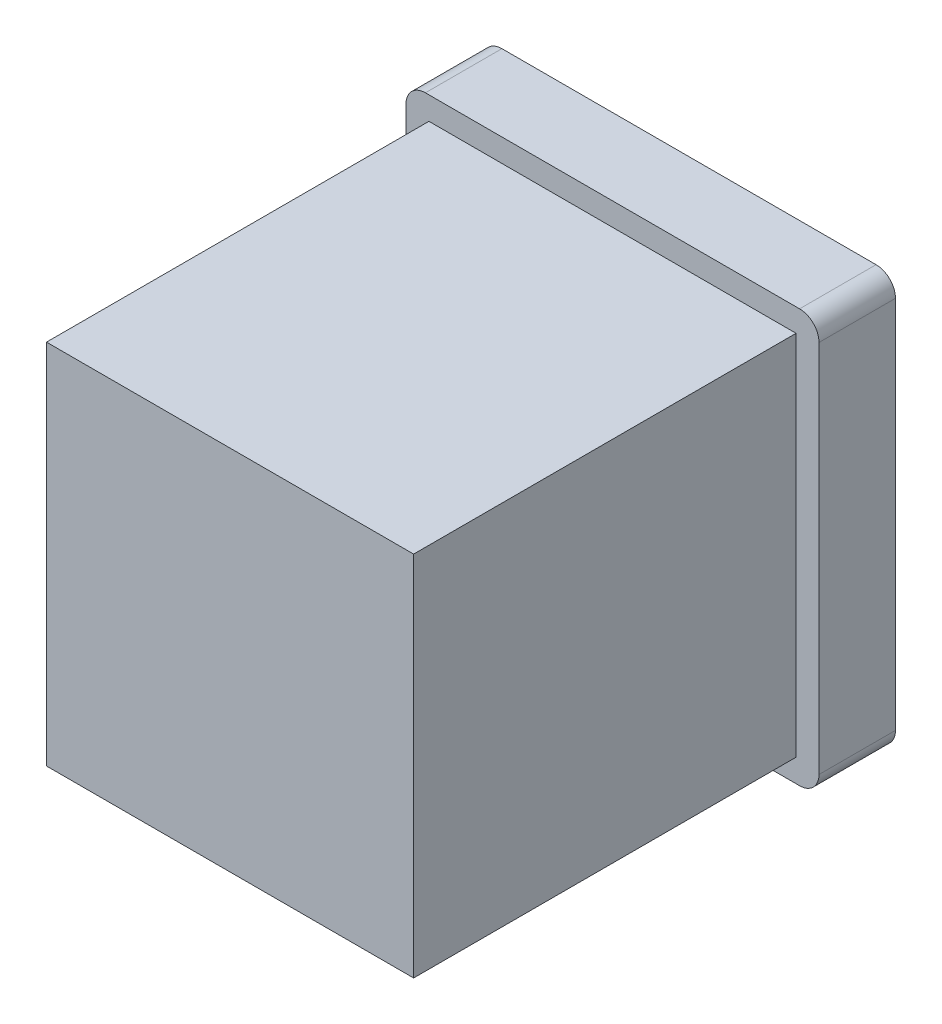
ISO-10303-21;
HEADER;
FILE_DESCRIPTION(('STEP AP214'),'2;1');
FILE_NAME('part.step','',(''),(''),'','','');
FILE_SCHEMA(('AUTOMOTIVE_DESIGN { 1 0 10303 214 1 1 1 1 }'));
ENDSEC;
DATA;
#1=APPLICATION_CONTEXT('core data for automotive mechanical design processes');
#2=APPLICATION_PROTOCOL_DEFINITION('international standard','automotive_design',2000,#1);
#3=PRODUCT_CONTEXT('',#1,'mechanical');
#4=PRODUCT('Part','Part','',(#3));
#5=PRODUCT_RELATED_PRODUCT_CATEGORY('part','',(#4));
#6=PRODUCT_DEFINITION_FORMATION('','',#4);
#7=PRODUCT_DEFINITION_CONTEXT('part definition',#1,'design');
#8=PRODUCT_DEFINITION('design','',#6,#7);
#9=PRODUCT_DEFINITION_SHAPE('','',#8);
#10=(LENGTH_UNIT() NAMED_UNIT(*) SI_UNIT(.MILLI.,.METRE.));
#11=(NAMED_UNIT(*) PLANE_ANGLE_UNIT() SI_UNIT($,.RADIAN.));
#12=(NAMED_UNIT(*) SI_UNIT($,.STERADIAN.) SOLID_ANGLE_UNIT());
#13=UNCERTAINTY_MEASURE_WITH_UNIT(LENGTH_MEASURE(1.E-05),#10,'distance_accuracy_value','');
#14=(GEOMETRIC_REPRESENTATION_CONTEXT(3) GLOBAL_UNCERTAINTY_ASSIGNED_CONTEXT((#13)) GLOBAL_UNIT_ASSIGNED_CONTEXT((#10,
#11,#12)) REPRESENTATION_CONTEXT('',''));
#15=CARTESIAN_POINT('',(0.,0.,0.));
#16=DIRECTION('',(0.,0.,1.));
#17=DIRECTION('',(1.,0.,0.));
#18=AXIS2_PLACEMENT_3D('',#15,#16,#17);
#19=CARTESIAN_POINT('',(0.,0.,5.));
#20=DIRECTION('',(0.,0.,-1.));
#21=DIRECTION('',(-1.,0.,0.));
#22=AXIS2_PLACEMENT_3D('',#19,#20,#21);
#23=PLANE('',#22);
#24=DIRECTION('',(0.,-1.,0.));
#25=VECTOR('',#24,1.);
#26=CARTESIAN_POINT('',(0.,0.,5.));
#27=LINE('',#26,#25);
#28=CARTESIAN_POINT('',(0.,25.73,5.));
#29=VERTEX_POINT('',#28);
#30=CARTESIAN_POINT('',(0.,1.27,5.));
#31=VERTEX_POINT('',#30);
#32=EDGE_CURVE('E330',#29,#31,#27,.T.);
#33=ORIENTED_EDGE('',*,*,#32,.T.);
#34=CARTESIAN_POINT('',(1.27,1.27,5.));
#35=DIRECTION('',(0.,0.,-1.));
#36=DIRECTION('',(-1.,0.,0.));
#37=AXIS2_PLACEMENT_3D('',#34,#35,#36);
#38=CIRCLE('',#37,1.27);
#39=CARTESIAN_POINT('',(1.27,0.,5.));
#40=VERTEX_POINT('',#39);
#41=EDGE_CURVE('E377',#31,#40,#38,.F.);
#42=ORIENTED_EDGE('',*,*,#41,.T.);
#43=DIRECTION('',(1.,0.,0.));
#44=VECTOR('',#43,1.);
#45=CARTESIAN_POINT('',(0.,0.,5.));
#46=LINE('',#45,#44);
#47=CARTESIAN_POINT('',(25.73,0.,5.));
#48=VERTEX_POINT('',#47);
#49=EDGE_CURVE('E333',#40,#48,#46,.T.);
#50=ORIENTED_EDGE('',*,*,#49,.T.);
#51=CARTESIAN_POINT('',(25.73,1.27,5.));
#52=DIRECTION('',(0.,0.,-1.));
#53=DIRECTION('',(-1.,0.,0.));
#54=AXIS2_PLACEMENT_3D('',#51,#52,#53);
#55=CIRCLE('',#54,1.27);
#56=CARTESIAN_POINT('',(27.,1.27,5.));
#57=VERTEX_POINT('',#56);
#58=EDGE_CURVE('E375',#48,#57,#55,.F.);
#59=ORIENTED_EDGE('',*,*,#58,.T.);
#60=DIRECTION('',(0.,1.,0.));
#61=VECTOR('',#60,1.);
#62=CARTESIAN_POINT('',(27.,0.,5.));
#63=LINE('',#62,#61);
#64=CARTESIAN_POINT('',(27.,25.73,5.));
#65=VERTEX_POINT('',#64);
#66=EDGE_CURVE('E337',#57,#65,#63,.T.);
#67=ORIENTED_EDGE('',*,*,#66,.T.);
#68=CARTESIAN_POINT('',(25.73,25.73,5.));
#69=DIRECTION('',(0.,0.,-1.));
#70=DIRECTION('',(-1.,0.,0.));
#71=AXIS2_PLACEMENT_3D('',#68,#69,#70);
#72=CIRCLE('',#71,1.27);
#73=CARTESIAN_POINT('',(25.73,27.,5.));
#74=VERTEX_POINT('',#73);
#75=EDGE_CURVE('E371',#65,#74,#72,.F.);
#76=ORIENTED_EDGE('',*,*,#75,.T.);
#77=DIRECTION('',(-1.,0.,0.));
#78=VECTOR('',#77,1.);
#79=CARTESIAN_POINT('',(0.,27.,5.));
#80=LINE('',#79,#78);
#81=CARTESIAN_POINT('',(1.27,27.,5.));
#82=VERTEX_POINT('',#81);
#83=EDGE_CURVE('E340',#74,#82,#80,.T.);
#84=ORIENTED_EDGE('',*,*,#83,.T.);
#85=CARTESIAN_POINT('',(1.27,25.73,5.));
#86=DIRECTION('',(0.,0.,-1.));
#87=DIRECTION('',(-1.,0.,0.));
#88=AXIS2_PLACEMENT_3D('',#85,#86,#87);
#89=CIRCLE('',#88,1.27);
#90=EDGE_CURVE('E373',#82,#29,#89,.F.);
#91=ORIENTED_EDGE('',*,*,#90,.T.);
#92=EDGE_LOOP('',(#33,#42,#50,#59,#67,#76,#84,#91));
#93=FACE_BOUND('',#92,.T.);
#94=DIRECTION('',(0.,-1.,0.));
#95=VECTOR('',#94,1.);
#96=CARTESIAN_POINT('',(1.5,25.5,5.));
#97=LINE('',#96,#95);
#98=CARTESIAN_POINT('',(1.5,25.5,5.));
#99=VERTEX_POINT('',#98);
#100=CARTESIAN_POINT('',(1.5,1.5,5.));
#101=VERTEX_POINT('',#100);
#102=EDGE_CURVE('E290',#99,#101,#97,.T.);
#103=ORIENTED_EDGE('',*,*,#102,.F.);
#104=DIRECTION('',(-1.,0.,0.));
#105=VECTOR('',#104,1.);
#106=CARTESIAN_POINT('',(1.5,25.5,5.));
#107=LINE('',#106,#105);
#108=CARTESIAN_POINT('',(25.5,25.5,5.));
#109=VERTEX_POINT('',#108);
#110=EDGE_CURVE('E301',#109,#99,#107,.T.);
#111=ORIENTED_EDGE('',*,*,#110,.F.);
#112=DIRECTION('',(0.,1.,0.));
#113=VECTOR('',#112,1.);
#114=CARTESIAN_POINT('',(25.5,25.5,5.));
#115=LINE('',#114,#113);
#116=CARTESIAN_POINT('',(25.5,1.5,5.));
#117=VERTEX_POINT('',#116);
#118=EDGE_CURVE('E313',#117,#109,#115,.T.);
#119=ORIENTED_EDGE('',*,*,#118,.F.);
#120=DIRECTION('',(1.,0.,0.));
#121=VECTOR('',#120,1.);
#122=CARTESIAN_POINT('',(1.5,1.5,5.));
#123=LINE('',#122,#121);
#124=EDGE_CURVE('E310',#101,#117,#123,.T.);
#125=ORIENTED_EDGE('',*,*,#124,.F.);
#126=EDGE_LOOP('',(#103,#111,#119,#125));
#127=FACE_BOUND('',#126,.T.);
#128=ADVANCED_FACE('F36',(#93,#127),#23,.F.);
#129=CARTESIAN_POINT('',(0.,0.,5.));
#130=DIRECTION('',(1.,0.,0.));
#131=DIRECTION('',(0.,1.,0.));
#132=AXIS2_PLACEMENT_3D('',#129,#130,#131);
#133=PLANE('',#132);
#134=DIRECTION('',(0.,-1.,0.));
#135=VECTOR('',#134,1.);
#136=CARTESIAN_POINT('',(0.,0.,0.));
#137=LINE('',#136,#135);
#138=CARTESIAN_POINT('',(0.,25.73,0.));
#139=VERTEX_POINT('',#138);
#140=CARTESIAN_POINT('',(0.,1.27,0.));
#141=VERTEX_POINT('',#140);
#142=EDGE_CURVE('E329',#139,#141,#137,.T.);
#143=ORIENTED_EDGE('',*,*,#142,.T.);
#144=DIRECTION('',(0.,0.,-1.));
#145=VECTOR('',#144,1.);
#146=CARTESIAN_POINT('',(0.,1.27,5.));
#147=LINE('',#146,#145);
#148=EDGE_CURVE('E369',#141,#31,#147,.F.);
#149=ORIENTED_EDGE('',*,*,#148,.T.);
#150=ORIENTED_EDGE('',*,*,#32,.F.);
#151=DIRECTION('',(0.,0.,-1.));
#152=VECTOR('',#151,1.);
#153=CARTESIAN_POINT('',(0.,25.73,5.));
#154=LINE('',#153,#152);
#155=EDGE_CURVE('E366',#29,#139,#154,.T.);
#156=ORIENTED_EDGE('',*,*,#155,.T.);
#157=EDGE_LOOP('',(#143,#149,#150,#156));
#158=FACE_BOUND('',#157,.T.);
#159=ADVANCED_FACE('F403',(#158),#133,.F.);
#160=CARTESIAN_POINT('',(0.,0.,5.));
#161=DIRECTION('',(0.,1.,0.));
#162=DIRECTION('',(0.,0.,1.));
#163=AXIS2_PLACEMENT_3D('',#160,#161,#162);
#164=PLANE('',#163);
#165=ORIENTED_EDGE('',*,*,#49,.F.);
#166=DIRECTION('',(0.,0.,-1.));
#167=VECTOR('',#166,1.);
#168=CARTESIAN_POINT('',(1.27,0.,5.));
#169=LINE('',#168,#167);
#170=CARTESIAN_POINT('',(1.27,0.,0.));
#171=VERTEX_POINT('',#170);
#172=EDGE_CURVE('E355',#40,#171,#169,.T.);
#173=ORIENTED_EDGE('',*,*,#172,.T.);
#174=DIRECTION('',(1.,0.,0.));
#175=VECTOR('',#174,1.);
#176=CARTESIAN_POINT('',(0.,0.,0.));
#177=LINE('',#176,#175);
#178=CARTESIAN_POINT('',(25.73,0.,0.));
#179=VERTEX_POINT('',#178);
#180=EDGE_CURVE('E346',#171,#179,#177,.T.);
#181=ORIENTED_EDGE('',*,*,#180,.T.);
#182=DIRECTION('',(0.,0.,-1.));
#183=VECTOR('',#182,1.);
#184=CARTESIAN_POINT('',(25.73,0.,5.));
#185=LINE('',#184,#183);
#186=EDGE_CURVE('E343',#179,#48,#185,.F.);
#187=ORIENTED_EDGE('',*,*,#186,.T.);
#188=EDGE_LOOP('',(#165,#173,#181,#187));
#189=FACE_BOUND('',#188,.T.);
#190=ADVANCED_FACE('F413',(#189),#164,.F.);
#191=CARTESIAN_POINT('',(27.,0.,5.));
#192=DIRECTION('',(-1.,0.,0.));
#193=DIRECTION('',(0.,-1.,0.));
#194=AXIS2_PLACEMENT_3D('',#191,#192,#193);
#195=PLANE('',#194);
#196=ORIENTED_EDGE('',*,*,#66,.F.);
#197=DIRECTION('',(0.,0.,-1.));
#198=VECTOR('',#197,1.);
#199=CARTESIAN_POINT('',(27.,1.27,5.));
#200=LINE('',#199,#198);
#201=CARTESIAN_POINT('',(27.,1.27,0.));
#202=VERTEX_POINT('',#201);
#203=EDGE_CURVE('E381',#57,#202,#200,.T.);
#204=ORIENTED_EDGE('',*,*,#203,.T.);
#205=DIRECTION('',(0.,1.,0.));
#206=VECTOR('',#205,1.);
#207=CARTESIAN_POINT('',(27.,0.,0.));
#208=LINE('',#207,#206);
#209=CARTESIAN_POINT('',(27.,25.73,0.));
#210=VERTEX_POINT('',#209);
#211=EDGE_CURVE('E349',#202,#210,#208,.T.);
#212=ORIENTED_EDGE('',*,*,#211,.T.);
#213=DIRECTION('',(0.,0.,-1.));
#214=VECTOR('',#213,1.);
#215=CARTESIAN_POINT('',(27.,25.73,5.));
#216=LINE('',#215,#214);
#217=EDGE_CURVE('E379',#210,#65,#216,.F.);
#218=ORIENTED_EDGE('',*,*,#217,.T.);
#219=EDGE_LOOP('',(#196,#204,#212,#218));
#220=FACE_BOUND('',#219,.T.);
#221=ADVANCED_FACE('F421',(#220),#195,.F.);
#222=CARTESIAN_POINT('',(0.,27.,5.));
#223=DIRECTION('',(0.,-1.,0.));
#224=DIRECTION('',(0.,0.,-1.));
#225=AXIS2_PLACEMENT_3D('',#222,#223,#224);
#226=PLANE('',#225);
#227=DIRECTION('',(-1.,0.,0.));
#228=VECTOR('',#227,1.);
#229=CARTESIAN_POINT('',(0.,27.,0.));
#230=LINE('',#229,#228);
#231=CARTESIAN_POINT('',(25.73,27.,0.));
#232=VERTEX_POINT('',#231);
#233=CARTESIAN_POINT('',(1.27,27.,0.));
#234=VERTEX_POINT('',#233);
#235=EDGE_CURVE('E334',#232,#234,#230,.T.);
#236=ORIENTED_EDGE('',*,*,#235,.T.);
#237=DIRECTION('',(0.,0.,-1.));
#238=VECTOR('',#237,1.);
#239=CARTESIAN_POINT('',(1.27,27.,5.));
#240=LINE('',#239,#238);
#241=EDGE_CURVE('E11',#234,#82,#240,.F.);
#242=ORIENTED_EDGE('',*,*,#241,.T.);
#243=ORIENTED_EDGE('',*,*,#83,.F.);
#244=DIRECTION('',(0.,0.,-1.));
#245=VECTOR('',#244,1.);
#246=CARTESIAN_POINT('',(25.73,27.,5.));
#247=LINE('',#246,#245);
#248=EDGE_CURVE('E44',#74,#232,#247,.T.);
#249=ORIENTED_EDGE('',*,*,#248,.T.);
#250=EDGE_LOOP('',(#236,#242,#243,#249));
#251=FACE_BOUND('',#250,.T.);
#252=ADVANCED_FACE('F388',(#251),#226,.F.);
#253=CARTESIAN_POINT('',(0.,0.,0.));
#254=DIRECTION('',(0.,0.,-1.));
#255=DIRECTION('',(-1.,0.,0.));
#256=AXIS2_PLACEMENT_3D('',#253,#254,#255);
#257=PLANE('',#256);
#258=CARTESIAN_POINT('',(13.6249536569698,7.82953983743972,0.));
#259=DIRECTION('',(0.,0.,-1.));
#260=DIRECTION('',(-1.,0.,0.));
#261=AXIS2_PLACEMENT_3D('',#258,#259,#260);
#262=CIRCLE('',#261,2.66495365696981);
#263=CARTESIAN_POINT('',(11.0849536569698,8.636,0.));
#264=VERTEX_POINT('',#263);
#265=CARTESIAN_POINT('',(16.1649536569698,8.636,0.));
#266=VERTEX_POINT('',#265);
#267=EDGE_CURVE('E51',#264,#266,#262,.T.);
#268=ORIENTED_EDGE('',*,*,#267,.F.);
#269=DIRECTION('',(0.,1.,0.));
#270=VECTOR('',#269,1.);
#271=CARTESIAN_POINT('',(11.0849536569698,5.08,0.));
#272=LINE('',#271,#270);
#273=CARTESIAN_POINT('',(11.0849536569698,5.08,0.));
#274=VERTEX_POINT('',#273);
#275=EDGE_CURVE('E216',#274,#264,#272,.T.);
#276=ORIENTED_EDGE('',*,*,#275,.F.);
#277=DIRECTION('',(-1.,0.,0.));
#278=VECTOR('',#277,1.);
#279=CARTESIAN_POINT('',(16.1649536569698,5.08,0.));
#280=LINE('',#279,#278);
#281=CARTESIAN_POINT('',(16.1649536569698,5.08,0.));
#282=VERTEX_POINT('',#281);
#283=EDGE_CURVE('E219',#282,#274,#280,.T.);
#284=ORIENTED_EDGE('',*,*,#283,.F.);
#285=DIRECTION('',(0.,-1.,0.));
#286=VECTOR('',#285,1.);
#287=CARTESIAN_POINT('',(16.1649536569698,5.08,0.));
#288=LINE('',#287,#286);
#289=EDGE_CURVE('E225',#266,#282,#288,.T.);
#290=ORIENTED_EDGE('',*,*,#289,.F.);
#291=EDGE_LOOP('',(#268,#276,#284,#290));
#292=FACE_BOUND('',#291,.T.);
#293=DIRECTION('',(0.,-1.,0.));
#294=VECTOR('',#293,1.);
#295=CARTESIAN_POINT('',(8.89,23.19,0.));
#296=LINE('',#295,#294);
#297=CARTESIAN_POINT('',(8.89,23.19,0.));
#298=VERTEX_POINT('',#297);
#299=CARTESIAN_POINT('',(8.89,15.57,0.));
#300=VERTEX_POINT('',#299);
#301=EDGE_CURVE('E59',#298,#300,#296,.T.);
#302=ORIENTED_EDGE('',*,*,#301,.F.);
#303=DIRECTION('',(1.,0.,0.));
#304=VECTOR('',#303,1.);
#305=CARTESIAN_POINT('',(8.89,23.19,0.));
#306=LINE('',#305,#304);
#307=CARTESIAN_POINT('',(6.35,23.19,0.));
#308=VERTEX_POINT('',#307);
#309=EDGE_CURVE('E238',#308,#298,#306,.T.);
#310=ORIENTED_EDGE('',*,*,#309,.F.);
#311=DIRECTION('',(0.,1.,0.));
#312=VECTOR('',#311,1.);
#313=CARTESIAN_POINT('',(6.35,23.19,0.));
#314=LINE('',#313,#312);
#315=CARTESIAN_POINT('',(6.35,15.57,0.));
#316=VERTEX_POINT('',#315);
#317=EDGE_CURVE('E252',#316,#308,#314,.T.);
#318=ORIENTED_EDGE('',*,*,#317,.F.);
#319=DIRECTION('',(-1.,0.,0.));
#320=VECTOR('',#319,1.);
#321=CARTESIAN_POINT('',(8.89,15.57,0.));
#322=LINE('',#321,#320);
#323=EDGE_CURVE('E249',#300,#316,#322,.T.);
#324=ORIENTED_EDGE('',*,*,#323,.F.);
#325=EDGE_LOOP('',(#302,#310,#318,#324));
#326=FACE_BOUND('',#325,.T.);
#327=DIRECTION('',(0.,-1.,0.));
#328=VECTOR('',#327,1.);
#329=CARTESIAN_POINT('',(20.65,23.19,0.));
#330=LINE('',#329,#328);
#331=CARTESIAN_POINT('',(20.65,23.19,0.));
#332=VERTEX_POINT('',#331);
#333=CARTESIAN_POINT('',(20.65,15.57,0.));
#334=VERTEX_POINT('',#333);
#335=EDGE_CURVE('E259',#332,#334,#330,.T.);
#336=ORIENTED_EDGE('',*,*,#335,.F.);
#337=DIRECTION('',(1.,0.,0.));
#338=VECTOR('',#337,1.);
#339=CARTESIAN_POINT('',(20.65,23.19,0.));
#340=LINE('',#339,#338);
#341=CARTESIAN_POINT('',(18.11,23.19,0.));
#342=VERTEX_POINT('',#341);
#343=EDGE_CURVE('E269',#342,#332,#340,.T.);
#344=ORIENTED_EDGE('',*,*,#343,.F.);
#345=DIRECTION('',(0.,1.,0.));
#346=VECTOR('',#345,1.);
#347=CARTESIAN_POINT('',(18.11,23.19,0.));
#348=LINE('',#347,#346);
#349=CARTESIAN_POINT('',(18.11,15.57,0.));
#350=VERTEX_POINT('',#349);
#351=EDGE_CURVE('E283',#350,#342,#348,.T.);
#352=ORIENTED_EDGE('',*,*,#351,.F.);
#353=DIRECTION('',(-1.,0.,0.));
#354=VECTOR('',#353,1.);
#355=CARTESIAN_POINT('',(20.65,15.57,0.));
#356=LINE('',#355,#354);
#357=EDGE_CURVE('E280',#334,#350,#356,.T.);
#358=ORIENTED_EDGE('',*,*,#357,.F.);
#359=EDGE_LOOP('',(#336,#344,#352,#358));
#360=FACE_BOUND('',#359,.T.);
#361=ORIENTED_EDGE('',*,*,#180,.F.);
#362=CARTESIAN_POINT('',(1.27,1.27,0.));
#363=DIRECTION('',(0.,0.,-1.));
#364=DIRECTION('',(-1.,0.,0.));
#365=AXIS2_PLACEMENT_3D('',#362,#363,#364);
#366=CIRCLE('',#365,1.27);
#367=EDGE_CURVE('E364',#171,#141,#366,.T.);
#368=ORIENTED_EDGE('',*,*,#367,.T.);
#369=ORIENTED_EDGE('',*,*,#142,.F.);
#370=CARTESIAN_POINT('',(1.27,25.73,0.));
#371=DIRECTION('',(0.,0.,-1.));
#372=DIRECTION('',(-1.,0.,0.));
#373=AXIS2_PLACEMENT_3D('',#370,#371,#372);
#374=CIRCLE('',#373,1.27);
#375=EDGE_CURVE('E360',#139,#234,#374,.T.);
#376=ORIENTED_EDGE('',*,*,#375,.T.);
#377=ORIENTED_EDGE('',*,*,#235,.F.);
#378=CARTESIAN_POINT('',(25.73,25.73,0.));
#379=DIRECTION('',(0.,0.,-1.));
#380=DIRECTION('',(-1.,0.,0.));
#381=AXIS2_PLACEMENT_3D('',#378,#379,#380);
#382=CIRCLE('',#381,1.27);
#383=EDGE_CURVE('E358',#232,#210,#382,.T.);
#384=ORIENTED_EDGE('',*,*,#383,.T.);
#385=ORIENTED_EDGE('',*,*,#211,.F.);
#386=CARTESIAN_POINT('',(25.73,1.27,0.));
#387=DIRECTION('',(0.,0.,-1.));
#388=DIRECTION('',(-1.,0.,0.));
#389=AXIS2_PLACEMENT_3D('',#386,#387,#388);
#390=CIRCLE('',#389,1.27);
#391=EDGE_CURVE('E362',#202,#179,#390,.T.);
#392=ORIENTED_EDGE('',*,*,#391,.T.);
#393=EDGE_LOOP('',(#361,#368,#369,#376,#377,#384,#385,#392));
#394=FACE_BOUND('',#393,.T.);
#395=ADVANCED_FACE('F394',(#292,#326,#360,#394),#257,.T.);
#396=CARTESIAN_POINT('',(1.5,25.5,30.));
#397=DIRECTION('',(1.,0.,0.));
#398=DIRECTION('',(0.,1.,0.));
#399=AXIS2_PLACEMENT_3D('',#396,#397,#398);
#400=PLANE('',#399);
#401=ORIENTED_EDGE('',*,*,#102,.T.);
#402=DIRECTION('',(0.,0.,-1.));
#403=VECTOR('',#402,1.);
#404=CARTESIAN_POINT('',(1.5,1.5,30.));
#405=LINE('',#404,#403);
#406=CARTESIAN_POINT('',(1.5,1.5,30.));
#407=VERTEX_POINT('',#406);
#408=EDGE_CURVE('E326',#407,#101,#405,.T.);
#409=ORIENTED_EDGE('',*,*,#408,.F.);
#410=DIRECTION('',(0.,-1.,0.));
#411=VECTOR('',#410,1.);
#412=CARTESIAN_POINT('',(1.5,25.5,30.));
#413=LINE('',#412,#411);
#414=CARTESIAN_POINT('',(1.5,25.5,30.));
#415=VERTEX_POINT('',#414);
#416=EDGE_CURVE('E297',#415,#407,#413,.T.);
#417=ORIENTED_EDGE('',*,*,#416,.F.);
#418=DIRECTION('',(0.,0.,-1.));
#419=VECTOR('',#418,1.);
#420=CARTESIAN_POINT('',(1.5,25.5,30.));
#421=LINE('',#420,#419);
#422=EDGE_CURVE('E307',#415,#99,#421,.T.);
#423=ORIENTED_EDGE('',*,*,#422,.T.);
#424=EDGE_LOOP('',(#401,#409,#417,#423));
#425=FACE_BOUND('',#424,.T.);
#426=ADVANCED_FACE('F440',(#425),#400,.F.);
#427=CARTESIAN_POINT('',(1.5,1.5,30.));
#428=DIRECTION('',(0.,1.,0.));
#429=DIRECTION('',(-1.,0.,0.));
#430=AXIS2_PLACEMENT_3D('',#427,#428,#429);
#431=PLANE('',#430);
#432=ORIENTED_EDGE('',*,*,#124,.T.);
#433=DIRECTION('',(0.,0.,-1.));
#434=VECTOR('',#433,1.);
#435=CARTESIAN_POINT('',(25.5,1.5,30.));
#436=LINE('',#435,#434);
#437=CARTESIAN_POINT('',(25.5,1.5,30.));
#438=VERTEX_POINT('',#437);
#439=EDGE_CURVE('E323',#438,#117,#436,.T.);
#440=ORIENTED_EDGE('',*,*,#439,.F.);
#441=DIRECTION('',(1.,0.,0.));
#442=VECTOR('',#441,1.);
#443=CARTESIAN_POINT('',(1.5,1.5,30.));
#444=LINE('',#443,#442);
#445=EDGE_CURVE('E300',#407,#438,#444,.T.);
#446=ORIENTED_EDGE('',*,*,#445,.F.);
#447=ORIENTED_EDGE('',*,*,#408,.T.);
#448=EDGE_LOOP('',(#432,#440,#446,#447));
#449=FACE_BOUND('',#448,.T.);
#450=ADVANCED_FACE('F629',(#449),#431,.F.);
#451=CARTESIAN_POINT('',(25.5,25.5,30.));
#452=DIRECTION('',(-1.,0.,0.));
#453=DIRECTION('',(0.,0.,1.));
#454=AXIS2_PLACEMENT_3D('',#451,#452,#453);
#455=PLANE('',#454);
#456=ORIENTED_EDGE('',*,*,#118,.T.);
#457=DIRECTION('',(0.,0.,-1.));
#458=VECTOR('',#457,1.);
#459=CARTESIAN_POINT('',(25.5,25.5,30.));
#460=LINE('',#459,#458);
#461=CARTESIAN_POINT('',(25.5,25.5,30.));
#462=VERTEX_POINT('',#461);
#463=EDGE_CURVE('E320',#462,#109,#460,.T.);
#464=ORIENTED_EDGE('',*,*,#463,.F.);
#465=DIRECTION('',(0.,1.,0.));
#466=VECTOR('',#465,1.);
#467=CARTESIAN_POINT('',(25.5,25.5,30.));
#468=LINE('',#467,#466);
#469=EDGE_CURVE('E303',#438,#462,#468,.T.);
#470=ORIENTED_EDGE('',*,*,#469,.F.);
#471=ORIENTED_EDGE('',*,*,#439,.T.);
#472=EDGE_LOOP('',(#456,#464,#470,#471));
#473=FACE_BOUND('',#472,.T.);
#474=ADVANCED_FACE('F626',(#473),#455,.F.);
#475=CARTESIAN_POINT('',(1.5,25.5,30.));
#476=DIRECTION('',(0.,-1.,0.));
#477=DIRECTION('',(0.,0.,-1.));
#478=AXIS2_PLACEMENT_3D('',#475,#476,#477);
#479=PLANE('',#478);
#480=ORIENTED_EDGE('',*,*,#110,.T.);
#481=ORIENTED_EDGE('',*,*,#422,.F.);
#482=DIRECTION('',(-1.,0.,0.));
#483=VECTOR('',#482,1.);
#484=CARTESIAN_POINT('',(1.5,25.5,30.));
#485=LINE('',#484,#483);
#486=EDGE_CURVE('E305',#462,#415,#485,.T.);
#487=ORIENTED_EDGE('',*,*,#486,.F.);
#488=ORIENTED_EDGE('',*,*,#463,.T.);
#489=EDGE_LOOP('',(#480,#481,#487,#488));
#490=FACE_BOUND('',#489,.T.);
#491=ADVANCED_FACE('F622',(#490),#479,.F.);
#492=CARTESIAN_POINT('',(0.,0.,30.));
#493=DIRECTION('',(0.,0.,1.));
#494=DIRECTION('',(1.,0.,0.));
#495=AXIS2_PLACEMENT_3D('',#492,#493,#494);
#496=PLANE('',#495);
#497=ORIENTED_EDGE('',*,*,#416,.T.);
#498=ORIENTED_EDGE('',*,*,#445,.T.);
#499=ORIENTED_EDGE('',*,*,#469,.T.);
#500=ORIENTED_EDGE('',*,*,#486,.T.);
#501=EDGE_LOOP('',(#497,#498,#499,#500));
#502=FACE_BOUND('',#501,.T.);
#503=ADVANCED_FACE('F453',(#502),#496,.T.);
#504=CARTESIAN_POINT('',(1.27,1.27,5.));
#505=DIRECTION('',(0.,0.,-1.));
#506=DIRECTION('',(-1.,0.,0.));
#507=AXIS2_PLACEMENT_3D('',#504,#505,#506);
#508=CYLINDRICAL_SURFACE('',#507,1.27);
#509=ORIENTED_EDGE('',*,*,#41,.F.);
#510=ORIENTED_EDGE('',*,*,#148,.F.);
#511=ORIENTED_EDGE('',*,*,#367,.F.);
#512=ORIENTED_EDGE('',*,*,#172,.F.);
#513=EDGE_LOOP('',(#509,#510,#511,#512));
#514=FACE_BOUND('',#513,.T.);
#515=ADVANCED_FACE('F411',(#514),#508,.T.);
#516=CARTESIAN_POINT('',(25.73,1.27,5.));
#517=DIRECTION('',(0.,0.,-1.));
#518=DIRECTION('',(-1.,0.,0.));
#519=AXIS2_PLACEMENT_3D('',#516,#517,#518);
#520=CYLINDRICAL_SURFACE('',#519,1.27);
#521=ORIENTED_EDGE('',*,*,#58,.F.);
#522=ORIENTED_EDGE('',*,*,#186,.F.);
#523=ORIENTED_EDGE('',*,*,#391,.F.);
#524=ORIENTED_EDGE('',*,*,#203,.F.);
#525=EDGE_LOOP('',(#521,#522,#523,#524));
#526=FACE_BOUND('',#525,.T.);
#527=ADVANCED_FACE('F418',(#526),#520,.T.);
#528=CARTESIAN_POINT('',(1.27,25.73,5.));
#529=DIRECTION('',(0.,0.,-1.));
#530=DIRECTION('',(-1.,0.,0.));
#531=AXIS2_PLACEMENT_3D('',#528,#529,#530);
#532=CYLINDRICAL_SURFACE('',#531,1.27);
#533=ORIENTED_EDGE('',*,*,#90,.F.);
#534=ORIENTED_EDGE('',*,*,#241,.F.);
#535=ORIENTED_EDGE('',*,*,#375,.F.);
#536=ORIENTED_EDGE('',*,*,#155,.F.);
#537=EDGE_LOOP('',(#533,#534,#535,#536));
#538=FACE_BOUND('',#537,.T.);
#539=ADVANCED_FACE('F400',(#538),#532,.T.);
#540=CARTESIAN_POINT('',(25.73,25.73,5.));
#541=DIRECTION('',(0.,0.,-1.));
#542=DIRECTION('',(-1.,0.,0.));
#543=AXIS2_PLACEMENT_3D('',#540,#541,#542);
#544=CYLINDRICAL_SURFACE('',#543,1.27);
#545=ORIENTED_EDGE('',*,*,#75,.F.);
#546=ORIENTED_EDGE('',*,*,#217,.F.);
#547=ORIENTED_EDGE('',*,*,#383,.F.);
#548=ORIENTED_EDGE('',*,*,#248,.F.);
#549=EDGE_LOOP('',(#545,#546,#547,#548));
#550=FACE_BOUND('',#549,.T.);
#551=ADVANCED_FACE('F38',(#550),#544,.T.);
#552=CARTESIAN_POINT('',(20.65,23.19,2.54));
#553=DIRECTION('',(1.,0.,0.));
#554=DIRECTION('',(0.,0.,-1.));
#555=AXIS2_PLACEMENT_3D('',#552,#553,#554);
#556=PLANE('',#555);
#557=ORIENTED_EDGE('',*,*,#335,.T.);
#558=DIRECTION('',(0.,0.,-1.));
#559=VECTOR('',#558,1.);
#560=CARTESIAN_POINT('',(20.65,15.57,2.54));
#561=LINE('',#560,#559);
#562=CARTESIAN_POINT('',(20.65,15.57,2.54));
#563=VERTEX_POINT('',#562);
#564=EDGE_CURVE('E278',#563,#334,#561,.T.);
#565=ORIENTED_EDGE('',*,*,#564,.F.);
#566=DIRECTION('',(0.,-1.,0.));
#567=VECTOR('',#566,1.);
#568=CARTESIAN_POINT('',(20.65,23.19,2.54));
#569=LINE('',#568,#567);
#570=CARTESIAN_POINT('',(20.65,23.19,2.54));
#571=VERTEX_POINT('',#570);
#572=EDGE_CURVE('E265',#571,#563,#569,.T.);
#573=ORIENTED_EDGE('',*,*,#572,.F.);
#574=DIRECTION('',(0.,0.,-1.));
#575=VECTOR('',#574,1.);
#576=CARTESIAN_POINT('',(20.65,23.19,2.54));
#577=LINE('',#576,#575);
#578=EDGE_CURVE('E288',#571,#332,#577,.T.);
#579=ORIENTED_EDGE('',*,*,#578,.T.);
#580=EDGE_LOOP('',(#557,#565,#573,#579));
#581=FACE_BOUND('',#580,.T.);
#582=ADVANCED_FACE('F424',(#581),#556,.F.);
#583=CARTESIAN_POINT('',(20.65,23.19,2.54));
#584=DIRECTION('',(0.,1.,0.));
#585=DIRECTION('',(0.,0.,1.));
#586=AXIS2_PLACEMENT_3D('',#583,#584,#585);
#587=PLANE('',#586);
#588=ORIENTED_EDGE('',*,*,#343,.T.);
#589=ORIENTED_EDGE('',*,*,#578,.F.);
#590=DIRECTION('',(1.,0.,0.));
#591=VECTOR('',#590,1.);
#592=CARTESIAN_POINT('',(20.65,23.19,2.54));
#593=LINE('',#592,#591);
#594=CARTESIAN_POINT('',(18.11,23.19,2.54));
#595=VERTEX_POINT('',#594);
#596=EDGE_CURVE('E275',#595,#571,#593,.T.);
#597=ORIENTED_EDGE('',*,*,#596,.F.);
#598=DIRECTION('',(0.,0.,-1.));
#599=VECTOR('',#598,1.);
#600=CARTESIAN_POINT('',(18.11,23.19,2.54));
#601=LINE('',#600,#599);
#602=EDGE_CURVE('E291',#595,#342,#601,.T.);
#603=ORIENTED_EDGE('',*,*,#602,.T.);
#604=EDGE_LOOP('',(#588,#589,#597,#603));
#605=FACE_BOUND('',#604,.T.);
#606=ADVANCED_FACE('F429',(#605),#587,.F.);
#607=CARTESIAN_POINT('',(18.11,23.19,2.54));
#608=DIRECTION('',(-1.,0.,0.));
#609=DIRECTION('',(0.,-1.,0.));
#610=AXIS2_PLACEMENT_3D('',#607,#608,#609);
#611=PLANE('',#610);
#612=ORIENTED_EDGE('',*,*,#351,.T.);
#613=ORIENTED_EDGE('',*,*,#602,.F.);
#614=DIRECTION('',(0.,1.,0.));
#615=VECTOR('',#614,1.);
#616=CARTESIAN_POINT('',(18.11,23.19,2.54));
#617=LINE('',#616,#615);
#618=CARTESIAN_POINT('',(18.11,15.57,2.54));
#619=VERTEX_POINT('',#618);
#620=EDGE_CURVE('E272',#619,#595,#617,.T.);
#621=ORIENTED_EDGE('',*,*,#620,.F.);
#622=DIRECTION('',(0.,0.,-1.));
#623=VECTOR('',#622,1.);
#624=CARTESIAN_POINT('',(18.11,15.57,2.54));
#625=LINE('',#624,#623);
#626=EDGE_CURVE('E293',#619,#350,#625,.T.);
#627=ORIENTED_EDGE('',*,*,#626,.T.);
#628=EDGE_LOOP('',(#612,#613,#621,#627));
#629=FACE_BOUND('',#628,.T.);
#630=ADVANCED_FACE('F491',(#629),#611,.F.);
#631=CARTESIAN_POINT('',(20.65,15.57,2.54));
#632=DIRECTION('',(0.,-1.,0.));
#633=DIRECTION('',(1.,0.,0.));
#634=AXIS2_PLACEMENT_3D('',#631,#632,#633);
#635=PLANE('',#634);
#636=ORIENTED_EDGE('',*,*,#357,.T.);
#637=ORIENTED_EDGE('',*,*,#626,.F.);
#638=DIRECTION('',(-1.,0.,0.));
#639=VECTOR('',#638,1.);
#640=CARTESIAN_POINT('',(20.65,15.57,2.54));
#641=LINE('',#640,#639);
#642=EDGE_CURVE('E268',#563,#619,#641,.T.);
#643=ORIENTED_EDGE('',*,*,#642,.F.);
#644=ORIENTED_EDGE('',*,*,#564,.T.);
#645=EDGE_LOOP('',(#636,#637,#643,#644));
#646=FACE_BOUND('',#645,.T.);
#647=ADVANCED_FACE('F501',(#646),#635,.F.);
#648=CARTESIAN_POINT('',(0.,0.,2.54));
#649=DIRECTION('',(0.,0.,-1.));
#650=DIRECTION('',(-1.,0.,0.));
#651=AXIS2_PLACEMENT_3D('',#648,#649,#650);
#652=PLANE('',#651);
#653=ORIENTED_EDGE('',*,*,#572,.T.);
#654=ORIENTED_EDGE('',*,*,#642,.T.);
#655=ORIENTED_EDGE('',*,*,#620,.T.);
#656=ORIENTED_EDGE('',*,*,#596,.T.);
#657=EDGE_LOOP('',(#653,#654,#655,#656));
#658=FACE_BOUND('',#657,.T.);
#659=ADVANCED_FACE('F511',(#658),#652,.T.);
#660=CARTESIAN_POINT('',(8.89,23.19,2.54));
#661=DIRECTION('',(1.,0.,0.));
#662=DIRECTION('',(0.,1.,0.));
#663=AXIS2_PLACEMENT_3D('',#660,#661,#662);
#664=PLANE('',#663);
#665=ORIENTED_EDGE('',*,*,#301,.T.);
#666=DIRECTION('',(0.,0.,-1.));
#667=VECTOR('',#666,1.);
#668=CARTESIAN_POINT('',(8.89,15.57,2.54));
#669=LINE('',#668,#667);
#670=CARTESIAN_POINT('',(8.89,15.57,2.54));
#671=VERTEX_POINT('',#670);
#672=EDGE_CURVE('E247',#671,#300,#669,.T.);
#673=ORIENTED_EDGE('',*,*,#672,.F.);
#674=DIRECTION('',(0.,-1.,0.));
#675=VECTOR('',#674,1.);
#676=CARTESIAN_POINT('',(8.89,23.19,2.54));
#677=LINE('',#676,#675);
#678=CARTESIAN_POINT('',(8.89,23.19,2.54));
#679=VERTEX_POINT('',#678);
#680=EDGE_CURVE('E234',#679,#671,#677,.T.);
#681=ORIENTED_EDGE('',*,*,#680,.F.);
#682=DIRECTION('',(0.,0.,-1.));
#683=VECTOR('',#682,1.);
#684=CARTESIAN_POINT('',(8.89,23.19,2.54));
#685=LINE('',#684,#683);
#686=EDGE_CURVE('E257',#679,#298,#685,.T.);
#687=ORIENTED_EDGE('',*,*,#686,.T.);
#688=EDGE_LOOP('',(#665,#673,#681,#687));
#689=FACE_BOUND('',#688,.T.);
#690=ADVANCED_FACE('F521',(#689),#664,.F.);
#691=CARTESIAN_POINT('',(8.89,23.19,2.54));
#692=DIRECTION('',(0.,1.,0.));
#693=DIRECTION('',(-1.,0.,0.));
#694=AXIS2_PLACEMENT_3D('',#691,#692,#693);
#695=PLANE('',#694);
#696=ORIENTED_EDGE('',*,*,#309,.T.);
#697=ORIENTED_EDGE('',*,*,#686,.F.);
#698=DIRECTION('',(1.,0.,0.));
#699=VECTOR('',#698,1.);
#700=CARTESIAN_POINT('',(8.89,23.19,2.54));
#701=LINE('',#700,#699);
#702=CARTESIAN_POINT('',(6.35,23.19,2.54));
#703=VERTEX_POINT('',#702);
#704=EDGE_CURVE('E244',#703,#679,#701,.T.);
#705=ORIENTED_EDGE('',*,*,#704,.F.);
#706=DIRECTION('',(0.,0.,-1.));
#707=VECTOR('',#706,1.);
#708=CARTESIAN_POINT('',(6.35,23.19,2.54));
#709=LINE('',#708,#707);
#710=EDGE_CURVE('E260',#703,#308,#709,.T.);
#711=ORIENTED_EDGE('',*,*,#710,.T.);
#712=EDGE_LOOP('',(#696,#697,#705,#711));
#713=FACE_BOUND('',#712,.T.);
#714=ADVANCED_FACE('F531',(#713),#695,.F.);
#715=CARTESIAN_POINT('',(6.35,23.19,2.54));
#716=DIRECTION('',(-1.,0.,0.));
#717=DIRECTION('',(0.,-1.,0.));
#718=AXIS2_PLACEMENT_3D('',#715,#716,#717);
#719=PLANE('',#718);
#720=ORIENTED_EDGE('',*,*,#317,.T.);
#721=ORIENTED_EDGE('',*,*,#710,.F.);
#722=DIRECTION('',(0.,1.,0.));
#723=VECTOR('',#722,1.);
#724=CARTESIAN_POINT('',(6.35,23.19,2.54));
#725=LINE('',#724,#723);
#726=CARTESIAN_POINT('',(6.35,15.57,2.54));
#727=VERTEX_POINT('',#726);
#728=EDGE_CURVE('E241',#727,#703,#725,.T.);
#729=ORIENTED_EDGE('',*,*,#728,.F.);
#730=DIRECTION('',(0.,0.,-1.));
#731=VECTOR('',#730,1.);
#732=CARTESIAN_POINT('',(6.35,15.57,2.54));
#733=LINE('',#732,#731);
#734=EDGE_CURVE('E262',#727,#316,#733,.T.);
#735=ORIENTED_EDGE('',*,*,#734,.T.);
#736=EDGE_LOOP('',(#720,#721,#729,#735));
#737=FACE_BOUND('',#736,.T.);
#738=ADVANCED_FACE('F540',(#737),#719,.F.);
#739=CARTESIAN_POINT('',(8.89,15.57,2.54));
#740=DIRECTION('',(0.,-1.,0.));
#741=DIRECTION('',(0.,0.,-1.));
#742=AXIS2_PLACEMENT_3D('',#739,#740,#741);
#743=PLANE('',#742);
#744=ORIENTED_EDGE('',*,*,#323,.T.);
#745=ORIENTED_EDGE('',*,*,#734,.F.);
#746=DIRECTION('',(-1.,0.,0.));
#747=VECTOR('',#746,1.);
#748=CARTESIAN_POINT('',(8.89,15.57,2.54));
#749=LINE('',#748,#747);
#750=EDGE_CURVE('E237',#671,#727,#749,.T.);
#751=ORIENTED_EDGE('',*,*,#750,.F.);
#752=ORIENTED_EDGE('',*,*,#672,.T.);
#753=EDGE_LOOP('',(#744,#745,#751,#752));
#754=FACE_BOUND('',#753,.T.);
#755=ADVANCED_FACE('F550',(#754),#743,.F.);
#756=CARTESIAN_POINT('',(0.,0.,2.54));
#757=DIRECTION('',(0.,0.,-1.));
#758=DIRECTION('',(-1.,0.,0.));
#759=AXIS2_PLACEMENT_3D('',#756,#757,#758);
#760=PLANE('',#759);
#761=ORIENTED_EDGE('',*,*,#680,.T.);
#762=ORIENTED_EDGE('',*,*,#750,.T.);
#763=ORIENTED_EDGE('',*,*,#728,.T.);
#764=ORIENTED_EDGE('',*,*,#704,.T.);
#765=EDGE_LOOP('',(#761,#762,#763,#764));
#766=FACE_BOUND('',#765,.T.);
#767=ADVANCED_FACE('F560',(#766),#760,.T.);
#768=CARTESIAN_POINT('',(13.6249536569698,7.82953983743972,2.54));
#769=DIRECTION('',(0.,0.,-1.));
#770=DIRECTION('',(-1.,0.,0.));
#771=AXIS2_PLACEMENT_3D('',#768,#769,#770);
#772=CYLINDRICAL_SURFACE('',#771,2.66495365696981);
#773=ORIENTED_EDGE('',*,*,#267,.T.);
#774=DIRECTION('',(0.,0.,-1.));
#775=VECTOR('',#774,1.);
#776=CARTESIAN_POINT('',(16.1649536569698,8.636,2.54));
#777=LINE('',#776,#775);
#778=CARTESIAN_POINT('',(16.1649536569698,8.636,2.54));
#779=VERTEX_POINT('',#778);
#780=EDGE_CURVE('E194',#779,#266,#777,.T.);
#781=ORIENTED_EDGE('',*,*,#780,.F.);
#782=CARTESIAN_POINT('',(13.6249536569698,7.82953983743972,2.54));
#783=DIRECTION('',(0.,0.,-1.));
#784=DIRECTION('',(-1.,0.,0.));
#785=AXIS2_PLACEMENT_3D('',#782,#783,#784);
#786=CIRCLE('',#785,2.66495365696981);
#787=CARTESIAN_POINT('',(11.0849536569698,8.636,2.54));
#788=VERTEX_POINT('',#787);
#789=EDGE_CURVE('E198',#788,#779,#786,.T.);
#790=ORIENTED_EDGE('',*,*,#789,.F.);
#791=DIRECTION('',(0.,0.,-1.));
#792=VECTOR('',#791,1.);
#793=CARTESIAN_POINT('',(11.0849536569698,8.636,2.54));
#794=LINE('',#793,#792);
#795=EDGE_CURVE('E229',#788,#264,#794,.T.);
#796=ORIENTED_EDGE('',*,*,#795,.T.);
#797=EDGE_LOOP('',(#773,#781,#790,#796));
#798=FACE_BOUND('',#797,.T.);
#799=ADVANCED_FACE('F196',(#798),#772,.F.);
#800=CARTESIAN_POINT('',(11.0849536569698,5.08,2.54));
#801=DIRECTION('',(-1.,0.,0.));
#802=DIRECTION('',(0.,0.,1.));
#803=AXIS2_PLACEMENT_3D('',#800,#801,#802);
#804=PLANE('',#803);
#805=ORIENTED_EDGE('',*,*,#275,.T.);
#806=ORIENTED_EDGE('',*,*,#795,.F.);
#807=DIRECTION('',(0.,1.,0.));
#808=VECTOR('',#807,1.);
#809=CARTESIAN_POINT('',(11.0849536569698,5.08,2.54));
#810=LINE('',#809,#808);
#811=CARTESIAN_POINT('',(11.0849536569698,5.08,2.54));
#812=VERTEX_POINT('',#811);
#813=EDGE_CURVE('E204',#812,#788,#810,.T.);
#814=ORIENTED_EDGE('',*,*,#813,.F.);
#815=DIRECTION('',(0.,0.,-1.));
#816=VECTOR('',#815,1.);
#817=CARTESIAN_POINT('',(11.0849536569698,5.08,2.54));
#818=LINE('',#817,#816);
#819=EDGE_CURVE('E231',#812,#274,#818,.T.);
#820=ORIENTED_EDGE('',*,*,#819,.T.);
#821=EDGE_LOOP('',(#805,#806,#814,#820));
#822=FACE_BOUND('',#821,.T.);
#823=ADVANCED_FACE('F579',(#822),#804,.F.);
#824=CARTESIAN_POINT('',(16.1649536569698,5.08,2.54));
#825=DIRECTION('',(0.,-1.,0.));
#826=DIRECTION('',(0.,0.,-1.));
#827=AXIS2_PLACEMENT_3D('',#824,#825,#826);
#828=PLANE('',#827);
#829=ORIENTED_EDGE('',*,*,#283,.T.);
#830=ORIENTED_EDGE('',*,*,#819,.F.);
#831=DIRECTION('',(-1.,0.,0.));
#832=VECTOR('',#831,1.);
#833=CARTESIAN_POINT('',(16.1649536569698,5.08,2.54));
#834=LINE('',#833,#832);
#835=CARTESIAN_POINT('',(16.1649536569698,5.08,2.54));
#836=VERTEX_POINT('',#835);
#837=EDGE_CURVE('E212',#836,#812,#834,.T.);
#838=ORIENTED_EDGE('',*,*,#837,.F.);
#839=DIRECTION('',(0.,0.,-1.));
#840=VECTOR('',#839,1.);
#841=CARTESIAN_POINT('',(16.1649536569698,5.08,2.54));
#842=LINE('',#841,#840);
#843=EDGE_CURVE('E203',#836,#282,#842,.T.);
#844=ORIENTED_EDGE('',*,*,#843,.T.);
#845=EDGE_LOOP('',(#829,#830,#838,#844));
#846=FACE_BOUND('',#845,.T.);
#847=ADVANCED_FACE('F588',(#846),#828,.F.);
#848=CARTESIAN_POINT('',(16.1649536569698,5.08,2.54));
#849=DIRECTION('',(1.,0.,0.));
#850=DIRECTION('',(0.,0.,-1.));
#851=AXIS2_PLACEMENT_3D('',#848,#849,#850);
#852=PLANE('',#851);
#853=ORIENTED_EDGE('',*,*,#289,.T.);
#854=ORIENTED_EDGE('',*,*,#843,.F.);
#855=DIRECTION('',(0.,-1.,0.));
#856=VECTOR('',#855,1.);
#857=CARTESIAN_POINT('',(16.1649536569698,5.08,2.54));
#858=LINE('',#857,#856);
#859=EDGE_CURVE('E207',#779,#836,#858,.T.);
#860=ORIENTED_EDGE('',*,*,#859,.F.);
#861=ORIENTED_EDGE('',*,*,#780,.T.);
#862=EDGE_LOOP('',(#853,#854,#860,#861));
#863=FACE_BOUND('',#862,.T.);
#864=ADVANCED_FACE('F208',(#863),#852,.F.);
#865=CARTESIAN_POINT('',(13.6249536569698,7.82953983743972,2.54));
#866=DIRECTION('',(0.,0.,-1.));
#867=DIRECTION('',(-1.,0.,0.));
#868=AXIS2_PLACEMENT_3D('',#865,#866,#867);
#869=PLANE('',#868);
#870=ORIENTED_EDGE('',*,*,#789,.T.);
#871=ORIENTED_EDGE('',*,*,#859,.T.);
#872=ORIENTED_EDGE('',*,*,#837,.T.);
#873=ORIENTED_EDGE('',*,*,#813,.T.);
#874=EDGE_LOOP('',(#870,#871,#872,#873));
#875=FACE_BOUND('',#874,.T.);
#876=ADVANCED_FACE('F214',(#875),#869,.T.);
#877=CLOSED_SHELL('',(#128,#159,#190,#221,#252,#395,#426,#450,#474,#491,#503,#515,#527,#539,
#551,#582,#606,#630,#647,#659,#690,#714,#738,#755,#767,#799,#823,#847,#864,#876));
#878=MANIFOLD_SOLID_BREP('B2',#877);
#879=ADVANCED_BREP_SHAPE_REPRESENTATION('',(#18,#878),#14);
#880=SHAPE_DEFINITION_REPRESENTATION(#9,#879);
ENDSEC;
END-ISO-10303-21;
